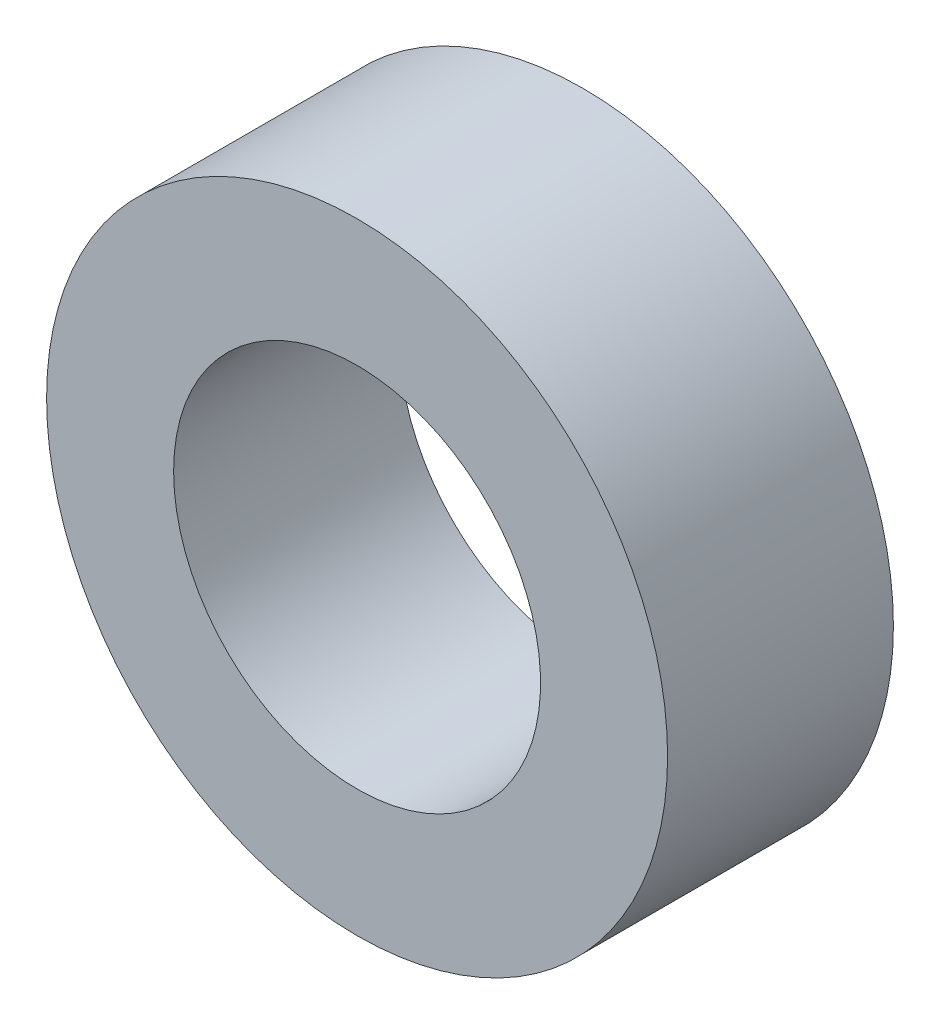
ISO-10303-21;
HEADER;
FILE_DESCRIPTION(('STEP AP214'),'2;1');
FILE_NAME('part.step','',(''),(''),'','','');
FILE_SCHEMA(('AUTOMOTIVE_DESIGN { 1 0 10303 214 1 1 1 1 }'));
ENDSEC;
DATA;
#1=APPLICATION_CONTEXT('core data for automotive mechanical design processes');
#2=APPLICATION_PROTOCOL_DEFINITION('international standard','automotive_design',2000,#1);
#3=PRODUCT_CONTEXT('',#1,'mechanical');
#4=PRODUCT('Part','Part','',(#3));
#5=PRODUCT_RELATED_PRODUCT_CATEGORY('part','',(#4));
#6=PRODUCT_DEFINITION_FORMATION('','',#4);
#7=PRODUCT_DEFINITION_CONTEXT('part definition',#1,'design');
#8=PRODUCT_DEFINITION('design','',#6,#7);
#9=PRODUCT_DEFINITION_SHAPE('','',#8);
#10=(LENGTH_UNIT() NAMED_UNIT(*) SI_UNIT(.MILLI.,.METRE.));
#11=(NAMED_UNIT(*) PLANE_ANGLE_UNIT() SI_UNIT($,.RADIAN.));
#12=(NAMED_UNIT(*) SI_UNIT($,.STERADIAN.) SOLID_ANGLE_UNIT());
#13=UNCERTAINTY_MEASURE_WITH_UNIT(LENGTH_MEASURE(1.E-05),#10,'distance_accuracy_value','');
#14=(GEOMETRIC_REPRESENTATION_CONTEXT(3) GLOBAL_UNCERTAINTY_ASSIGNED_CONTEXT((#13)) GLOBAL_UNIT_ASSIGNED_CONTEXT((#10,
#11,#12)) REPRESENTATION_CONTEXT('',''));
#15=CARTESIAN_POINT('',(0.,0.,0.));
#16=DIRECTION('',(0.,0.,1.));
#17=DIRECTION('',(1.,0.,0.));
#18=AXIS2_PLACEMENT_3D('',#15,#16,#17);
#19=CARTESIAN_POINT('',(0.,0.,0.));
#20=DIRECTION('',(0.,0.,-1.));
#21=DIRECTION('',(-1.,0.,0.));
#22=AXIS2_PLACEMENT_3D('',#19,#20,#21);
#23=CYLINDRICAL_SURFACE('',#22,6.5);
#24=CARTESIAN_POINT('',(0.,0.,0.));
#25=DIRECTION('',(0.,0.,-1.));
#26=DIRECTION('',(-1.,0.,0.));
#27=AXIS2_PLACEMENT_3D('',#24,#25,#26);
#28=CIRCLE('',#27,6.5);
#29=CARTESIAN_POINT('',(-6.5,0.,0.));
#30=VERTEX_POINT('',#29);
#31=EDGE_CURVE('E10',#30,#30,#28,.T.);
#32=ORIENTED_EDGE('',*,*,#31,.T.);
#33=EDGE_LOOP('',(#32));
#34=FACE_BOUND('',#33,.T.);
#35=CARTESIAN_POINT('',(0.,0.,8.));
#36=DIRECTION('',(0.,0.,-1.));
#37=DIRECTION('',(-1.,0.,0.));
#38=AXIS2_PLACEMENT_3D('',#35,#36,#37);
#39=CIRCLE('',#38,6.5);
#40=CARTESIAN_POINT('',(-6.5,0.,8.));
#41=VERTEX_POINT('',#40);
#42=EDGE_CURVE('E38',#41,#41,#39,.T.);
#43=ORIENTED_EDGE('',*,*,#42,.F.);
#44=EDGE_LOOP('',(#43));
#45=FACE_BOUND('',#44,.T.);
#46=ADVANCED_FACE('F15',(#34,#45),#23,.F.);
#47=CARTESIAN_POINT('',(0.,6.5,0.));
#48=DIRECTION('',(0.,0.,-1.));
#49=DIRECTION('',(-1.,0.,0.));
#50=AXIS2_PLACEMENT_3D('',#47,#48,#49);
#51=PLANE('',#50);
#52=CARTESIAN_POINT('',(0.,0.,0.));
#53=DIRECTION('',(0.,0.,-1.));
#54=DIRECTION('',(-1.,0.,0.));
#55=AXIS2_PLACEMENT_3D('',#52,#53,#54);
#56=CIRCLE('',#55,11.);
#57=CARTESIAN_POINT('',(-11.,0.,0.));
#58=VERTEX_POINT('',#57);
#59=EDGE_CURVE('E22',#58,#58,#56,.T.);
#60=ORIENTED_EDGE('',*,*,#59,.T.);
#61=EDGE_LOOP('',(#60));
#62=FACE_BOUND('',#61,.T.);
#63=ORIENTED_EDGE('',*,*,#31,.F.);
#64=EDGE_LOOP('',(#63));
#65=FACE_BOUND('',#64,.T.);
#66=ADVANCED_FACE('F51',(#62,#65),#51,.T.);
#67=CARTESIAN_POINT('',(0.,0.,0.));
#68=DIRECTION('',(0.,0.,-1.));
#69=DIRECTION('',(-1.,0.,0.));
#70=AXIS2_PLACEMENT_3D('',#67,#68,#69);
#71=CYLINDRICAL_SURFACE('',#70,11.);
#72=CARTESIAN_POINT('',(0.,0.,8.));
#73=DIRECTION('',(0.,0.,-1.));
#74=DIRECTION('',(-1.,0.,0.));
#75=AXIS2_PLACEMENT_3D('',#72,#73,#74);
#76=CIRCLE('',#75,11.);
#77=CARTESIAN_POINT('',(-11.,0.,8.));
#78=VERTEX_POINT('',#77);
#79=EDGE_CURVE('E31',#78,#78,#76,.T.);
#80=ORIENTED_EDGE('',*,*,#79,.T.);
#81=EDGE_LOOP('',(#80));
#82=FACE_BOUND('',#81,.T.);
#83=ORIENTED_EDGE('',*,*,#59,.F.);
#84=EDGE_LOOP('',(#83));
#85=FACE_BOUND('',#84,.T.);
#86=ADVANCED_FACE('F56',(#82,#85),#71,.T.);
#87=CARTESIAN_POINT('',(0.,11.,8.));
#88=DIRECTION('',(0.,0.,1.));
#89=DIRECTION('',(1.,0.,0.));
#90=AXIS2_PLACEMENT_3D('',#87,#88,#89);
#91=PLANE('',#90);
#92=ORIENTED_EDGE('',*,*,#42,.T.);
#93=EDGE_LOOP('',(#92));
#94=FACE_BOUND('',#93,.T.);
#95=ORIENTED_EDGE('',*,*,#79,.F.);
#96=EDGE_LOOP('',(#95));
#97=FACE_BOUND('',#96,.T.);
#98=ADVANCED_FACE('F47',(#94,#97),#91,.T.);
#99=CLOSED_SHELL('',(#46,#66,#86,#98));
#100=MANIFOLD_SOLID_BREP('B1',#99);
#101=ADVANCED_BREP_SHAPE_REPRESENTATION('',(#18,#100),#14);
#102=SHAPE_DEFINITION_REPRESENTATION(#9,#101);
ENDSEC;
END-ISO-10303-21;
